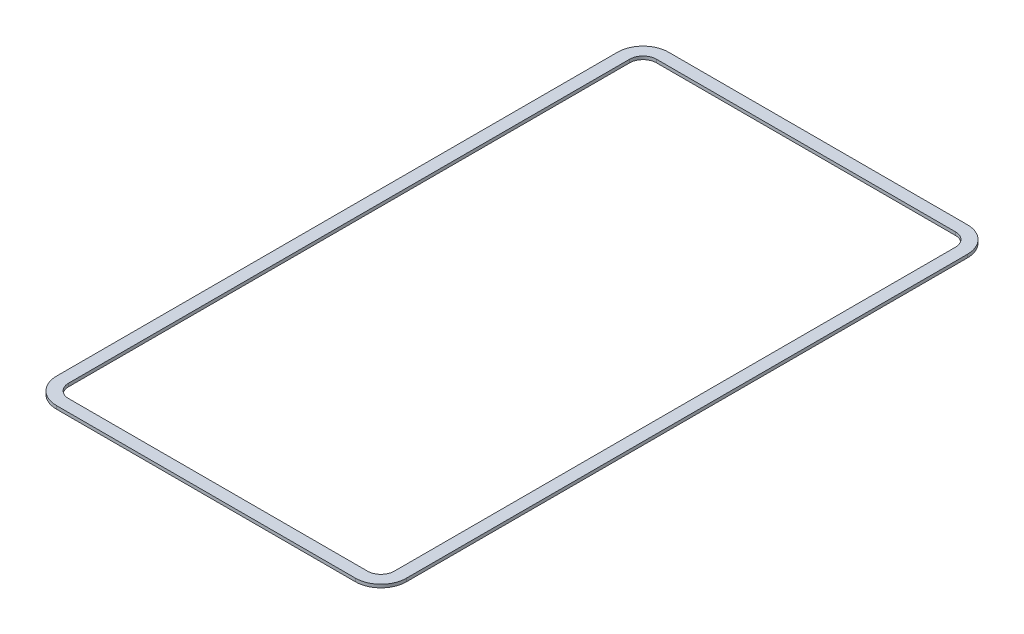
ISO-10303-21;
HEADER;
FILE_DESCRIPTION(('STEP AP214'),'2;1');
FILE_NAME('part.step','',(''),(''),'','','');
FILE_SCHEMA(('AUTOMOTIVE_DESIGN { 1 0 10303 214 1 1 1 1 }'));
ENDSEC;
DATA;
#1=APPLICATION_CONTEXT('core data for automotive mechanical design processes');
#2=APPLICATION_PROTOCOL_DEFINITION('international standard','automotive_design',2000,#1);
#3=PRODUCT_CONTEXT('',#1,'mechanical');
#4=PRODUCT('Part','Part','',(#3));
#5=PRODUCT_RELATED_PRODUCT_CATEGORY('part','',(#4));
#6=PRODUCT_DEFINITION_FORMATION('','',#4);
#7=PRODUCT_DEFINITION_CONTEXT('part definition',#1,'design');
#8=PRODUCT_DEFINITION('design','',#6,#7);
#9=PRODUCT_DEFINITION_SHAPE('','',#8);
#10=(LENGTH_UNIT() NAMED_UNIT(*) SI_UNIT(.MILLI.,.METRE.));
#11=(NAMED_UNIT(*) PLANE_ANGLE_UNIT() SI_UNIT($,.RADIAN.));
#12=(NAMED_UNIT(*) SI_UNIT($,.STERADIAN.) SOLID_ANGLE_UNIT());
#13=UNCERTAINTY_MEASURE_WITH_UNIT(LENGTH_MEASURE(1.E-05),#10,'distance_accuracy_value','');
#14=(GEOMETRIC_REPRESENTATION_CONTEXT(3) GLOBAL_UNCERTAINTY_ASSIGNED_CONTEXT((#13)) GLOBAL_UNIT_ASSIGNED_CONTEXT((#10,
#11,#12)) REPRESENTATION_CONTEXT('',''));
#15=CARTESIAN_POINT('',(0.,0.,0.));
#16=DIRECTION('',(0.,0.,1.));
#17=DIRECTION('',(1.,0.,0.));
#18=AXIS2_PLACEMENT_3D('',#15,#16,#17);
#19=CARTESIAN_POINT('',(-107.894695316434,0.5,-53.4146718146718));
#20=DIRECTION('',(0.,1.,0.));
#21=DIRECTION('',(0.,0.,1.));
#22=AXIS2_PLACEMENT_3D('',#19,#20,#21);
#23=PLANE('',#22);
#24=CARTESIAN_POINT('',(-107.894695316434,0.5,-53.4146718146718));
#25=DIRECTION('',(0.,1.,0.));
#26=DIRECTION('',(0.,0.,1.));
#27=AXIS2_PLACEMENT_3D('',#24,#25,#26);
#28=CIRCLE('',#27,4.);
#29=CARTESIAN_POINT('',(-107.894695316434,0.5,-57.4146718146718));
#30=VERTEX_POINT('',#29);
#31=CARTESIAN_POINT('',(-111.894695316434,0.5,-53.4146718146718));
#32=VERTEX_POINT('',#31);
#33=EDGE_CURVE('E270',#30,#32,#28,.T.);
#34=ORIENTED_EDGE('',*,*,#33,.T.);
#35=DIRECTION('',(0.,0.,1.));
#36=VECTOR('',#35,1.);
#37=CARTESIAN_POINT('',(-111.894695316434,0.5,-53.4146718146718));
#38=LINE('',#37,#36);
#39=CARTESIAN_POINT('',(-111.894695316434,0.5,34.5853281853282));
#40=VERTEX_POINT('',#39);
#41=EDGE_CURVE('E273',#32,#40,#38,.T.);
#42=ORIENTED_EDGE('',*,*,#41,.T.);
#43=CARTESIAN_POINT('',(-107.894695316434,0.5,34.5853281853282));
#44=DIRECTION('',(0.,1.,0.));
#45=DIRECTION('',(0.,0.,1.));
#46=AXIS2_PLACEMENT_3D('',#43,#44,#45);
#47=CIRCLE('',#46,4.);
#48=CARTESIAN_POINT('',(-107.894695316434,0.5,38.5853281853282));
#49=VERTEX_POINT('',#48);
#50=EDGE_CURVE('E276',#40,#49,#47,.T.);
#51=ORIENTED_EDGE('',*,*,#50,.T.);
#52=DIRECTION('',(1.,0.,0.));
#53=VECTOR('',#52,1.);
#54=CARTESIAN_POINT('',(-107.894695316434,0.5,38.5853281853282));
#55=LINE('',#54,#53);
#56=CARTESIAN_POINT('',(-61.0084676591858,0.5,38.5853281853282));
#57=VERTEX_POINT('',#56);
#58=EDGE_CURVE('E278',#49,#57,#55,.T.);
#59=ORIENTED_EDGE('',*,*,#58,.T.);
#60=CARTESIAN_POINT('',(-61.0084676591858,0.5,34.5853281853282));
#61=DIRECTION('',(0.,1.,0.));
#62=DIRECTION('',(0.,0.,1.));
#63=AXIS2_PLACEMENT_3D('',#60,#61,#62);
#64=CIRCLE('',#63,3.99999999999999);
#65=CARTESIAN_POINT('',(-57.0084676591858,0.5,34.5853281853282));
#66=VERTEX_POINT('',#65);
#67=EDGE_CURVE('E280',#57,#66,#64,.T.);
#68=ORIENTED_EDGE('',*,*,#67,.T.);
#69=DIRECTION('',(0.,0.,1.));
#70=VECTOR('',#69,1.);
#71=CARTESIAN_POINT('',(-57.0084676591858,0.5,-53.4146718146718));
#72=LINE('',#71,#70);
#73=CARTESIAN_POINT('',(-57.0084676591858,0.5,-53.4146718146718));
#74=VERTEX_POINT('',#73);
#75=EDGE_CURVE('E282',#74,#66,#72,.T.);
#76=ORIENTED_EDGE('',*,*,#75,.F.);
#77=CARTESIAN_POINT('',(-61.0084676591858,0.5,-53.4146718146718));
#78=DIRECTION('',(0.,-1.,0.));
#79=DIRECTION('',(0.,0.,-1.));
#80=AXIS2_PLACEMENT_3D('',#77,#78,#79);
#81=CIRCLE('',#80,4.);
#82=CARTESIAN_POINT('',(-61.0084676591858,0.5,-57.4146718146718));
#83=VERTEX_POINT('',#82);
#84=EDGE_CURVE('E285',#83,#74,#81,.T.);
#85=ORIENTED_EDGE('',*,*,#84,.F.);
#86=DIRECTION('',(1.,0.,0.));
#87=VECTOR('',#86,1.);
#88=CARTESIAN_POINT('',(-107.894695316434,0.5,-57.4146718146718));
#89=LINE('',#88,#87);
#90=EDGE_CURVE('E288',#30,#83,#89,.T.);
#91=ORIENTED_EDGE('',*,*,#90,.F.);
#92=EDGE_LOOP('',(#34,#42,#51,#59,#68,#76,#85,#91));
#93=FACE_BOUND('',#92,.T.);
#94=DIRECTION('',(0.,0.,1.));
#95=VECTOR('',#94,1.);
#96=CARTESIAN_POINT('',(-109.994695316434,0.5,-53.4146718146718));
#97=LINE('',#96,#95);
#98=CARTESIAN_POINT('',(-109.994695316434,0.5,-53.4146718146718));
#99=VERTEX_POINT('',#98);
#100=CARTESIAN_POINT('',(-109.994695316434,0.5,34.5853281853282));
#101=VERTEX_POINT('',#100);
#102=EDGE_CURVE('E212',#99,#101,#97,.T.);
#103=ORIENTED_EDGE('',*,*,#102,.F.);
#104=CARTESIAN_POINT('',(-107.894695316434,0.5,-53.4146718146718));
#105=DIRECTION('',(0.,1.,0.));
#106=DIRECTION('',(0.,0.,1.));
#107=AXIS2_PLACEMENT_3D('',#104,#105,#106);
#108=CIRCLE('',#107,2.1);
#109=CARTESIAN_POINT('',(-107.894695316434,0.5,-55.5146718146718));
#110=VERTEX_POINT('',#109);
#111=EDGE_CURVE('E203',#110,#99,#108,.T.);
#112=ORIENTED_EDGE('',*,*,#111,.F.);
#113=DIRECTION('',(1.,0.,0.));
#114=VECTOR('',#113,1.);
#115=CARTESIAN_POINT('',(-107.894695316434,0.5,-55.5146718146718));
#116=LINE('',#115,#114);
#117=CARTESIAN_POINT('',(-61.0084676591858,0.5,-55.5146718146718));
#118=VERTEX_POINT('',#117);
#119=EDGE_CURVE('E237',#110,#118,#116,.T.);
#120=ORIENTED_EDGE('',*,*,#119,.T.);
#121=CARTESIAN_POINT('',(-61.0084676591858,0.5,-53.4146718146718));
#122=DIRECTION('',(0.,-1.,0.));
#123=DIRECTION('',(0.,0.,-1.));
#124=AXIS2_PLACEMENT_3D('',#121,#122,#123);
#125=CIRCLE('',#124,2.09999999999999);
#126=CARTESIAN_POINT('',(-58.9084676591858,0.5,-53.4146718146718));
#127=VERTEX_POINT('',#126);
#128=EDGE_CURVE('E106',#118,#127,#125,.T.);
#129=ORIENTED_EDGE('',*,*,#128,.T.);
#130=DIRECTION('',(0.,0.,1.));
#131=VECTOR('',#130,1.);
#132=CARTESIAN_POINT('',(-58.9084676591858,0.5,-53.4146718146718));
#133=LINE('',#132,#131);
#134=CARTESIAN_POINT('',(-58.9084676591858,0.5,34.5853281853282));
#135=VERTEX_POINT('',#134);
#136=EDGE_CURVE('E233',#127,#135,#133,.T.);
#137=ORIENTED_EDGE('',*,*,#136,.T.);
#138=CARTESIAN_POINT('',(-61.0084676591858,0.5,34.5853281853282));
#139=DIRECTION('',(0.,1.,0.));
#140=DIRECTION('',(0.,0.,1.));
#141=AXIS2_PLACEMENT_3D('',#138,#139,#140);
#142=CIRCLE('',#141,2.1);
#143=CARTESIAN_POINT('',(-61.0084676591858,0.5,36.6853281853282));
#144=VERTEX_POINT('',#143);
#145=EDGE_CURVE('E231',#144,#135,#142,.T.);
#146=ORIENTED_EDGE('',*,*,#145,.F.);
#147=DIRECTION('',(1.,0.,0.));
#148=VECTOR('',#147,1.);
#149=CARTESIAN_POINT('',(-107.894695316434,0.5,36.6853281853282));
#150=LINE('',#149,#148);
#151=CARTESIAN_POINT('',(-107.894695316434,0.5,36.6853281853282));
#152=VERTEX_POINT('',#151);
#153=EDGE_CURVE('E227',#152,#144,#150,.T.);
#154=ORIENTED_EDGE('',*,*,#153,.F.);
#155=CARTESIAN_POINT('',(-107.894695316434,0.5,34.5853281853282));
#156=DIRECTION('',(0.,1.,0.));
#157=DIRECTION('',(0.,0.,1.));
#158=AXIS2_PLACEMENT_3D('',#155,#156,#157);
#159=CIRCLE('',#158,2.1);
#160=EDGE_CURVE('E225',#101,#152,#159,.T.);
#161=ORIENTED_EDGE('',*,*,#160,.F.);
#162=EDGE_LOOP('',(#103,#112,#120,#129,#137,#146,#154,#161));
#163=FACE_BOUND('',#162,.T.);
#164=ADVANCED_FACE('F91',(#93,#163),#23,.T.);
#165=CARTESIAN_POINT('',(-107.894695316434,0.,-53.4146718146718));
#166=DIRECTION('',(0.,1.,0.));
#167=DIRECTION('',(0.,0.,1.));
#168=AXIS2_PLACEMENT_3D('',#165,#166,#167);
#169=PLANE('',#168);
#170=CARTESIAN_POINT('',(-107.894695316434,0.,-53.4146718146718));
#171=DIRECTION('',(0.,1.,0.));
#172=DIRECTION('',(0.,0.,1.));
#173=AXIS2_PLACEMENT_3D('',#170,#171,#172);
#174=CIRCLE('',#173,4.);
#175=CARTESIAN_POINT('',(-107.894695316434,0.,-57.4146718146718));
#176=VERTEX_POINT('',#175);
#177=CARTESIAN_POINT('',(-111.894695316434,0.,-53.4146718146718));
#178=VERTEX_POINT('',#177);
#179=EDGE_CURVE('E220',#176,#178,#174,.T.);
#180=ORIENTED_EDGE('',*,*,#179,.F.);
#181=DIRECTION('',(1.,0.,0.));
#182=VECTOR('',#181,1.);
#183=CARTESIAN_POINT('',(-107.894695316434,0.,-57.4146718146718));
#184=LINE('',#183,#182);
#185=CARTESIAN_POINT('',(-61.0084676591858,0.,-57.4146718146718));
#186=VERTEX_POINT('',#185);
#187=EDGE_CURVE('E274',#176,#186,#184,.T.);
#188=ORIENTED_EDGE('',*,*,#187,.T.);
#189=CARTESIAN_POINT('',(-61.0084676591858,0.,-53.4146718146718));
#190=DIRECTION('',(0.,-1.,0.));
#191=DIRECTION('',(0.,0.,-1.));
#192=AXIS2_PLACEMENT_3D('',#189,#190,#191);
#193=CIRCLE('',#192,4.);
#194=CARTESIAN_POINT('',(-57.0084676591858,0.,-53.4146718146718));
#195=VERTEX_POINT('',#194);
#196=EDGE_CURVE('E306',#186,#195,#193,.T.);
#197=ORIENTED_EDGE('',*,*,#196,.T.);
#198=DIRECTION('',(0.,0.,1.));
#199=VECTOR('',#198,1.);
#200=CARTESIAN_POINT('',(-57.0084676591858,0.,-53.4146718146718));
#201=LINE('',#200,#199);
#202=CARTESIAN_POINT('',(-57.0084676591858,0.,34.5853281853282));
#203=VERTEX_POINT('',#202);
#204=EDGE_CURVE('E303',#195,#203,#201,.T.);
#205=ORIENTED_EDGE('',*,*,#204,.T.);
#206=CARTESIAN_POINT('',(-61.0084676591858,0.,34.5853281853282));
#207=DIRECTION('',(0.,1.,0.));
#208=DIRECTION('',(0.,0.,1.));
#209=AXIS2_PLACEMENT_3D('',#206,#207,#208);
#210=CIRCLE('',#209,3.99999999999999);
#211=CARTESIAN_POINT('',(-61.0084676591858,0.,38.5853281853282));
#212=VERTEX_POINT('',#211);
#213=EDGE_CURVE('E300',#212,#203,#210,.T.);
#214=ORIENTED_EDGE('',*,*,#213,.F.);
#215=DIRECTION('',(1.,0.,0.));
#216=VECTOR('',#215,1.);
#217=CARTESIAN_POINT('',(-107.894695316434,0.,38.5853281853282));
#218=LINE('',#217,#216);
#219=CARTESIAN_POINT('',(-107.894695316434,0.,38.5853281853282));
#220=VERTEX_POINT('',#219);
#221=EDGE_CURVE('E298',#220,#212,#218,.T.);
#222=ORIENTED_EDGE('',*,*,#221,.F.);
#223=CARTESIAN_POINT('',(-107.894695316434,0.,34.5853281853282));
#224=DIRECTION('',(0.,1.,0.));
#225=DIRECTION('',(0.,0.,1.));
#226=AXIS2_PLACEMENT_3D('',#223,#224,#225);
#227=CIRCLE('',#226,4.);
#228=CARTESIAN_POINT('',(-111.894695316434,0.,34.5853281853282));
#229=VERTEX_POINT('',#228);
#230=EDGE_CURVE('E296',#229,#220,#227,.T.);
#231=ORIENTED_EDGE('',*,*,#230,.F.);
#232=DIRECTION('',(0.,0.,1.));
#233=VECTOR('',#232,1.);
#234=CARTESIAN_POINT('',(-111.894695316434,0.,-53.4146718146718));
#235=LINE('',#234,#233);
#236=EDGE_CURVE('E294',#178,#229,#235,.T.);
#237=ORIENTED_EDGE('',*,*,#236,.F.);
#238=EDGE_LOOP('',(#180,#188,#197,#205,#214,#222,#231,#237));
#239=FACE_BOUND('',#238,.T.);
#240=CARTESIAN_POINT('',(-107.894695316434,0.,-53.4146718146718));
#241=DIRECTION('',(0.,1.,0.));
#242=DIRECTION('',(0.,0.,1.));
#243=AXIS2_PLACEMENT_3D('',#240,#241,#242);
#244=CIRCLE('',#243,2.1);
#245=CARTESIAN_POINT('',(-107.894695316434,0.,-55.5146718146718));
#246=VERTEX_POINT('',#245);
#247=CARTESIAN_POINT('',(-109.994695316434,0.,-53.4146718146718));
#248=VERTEX_POINT('',#247);
#249=EDGE_CURVE('E114',#246,#248,#244,.T.);
#250=ORIENTED_EDGE('',*,*,#249,.T.);
#251=DIRECTION('',(0.,0.,1.));
#252=VECTOR('',#251,1.);
#253=CARTESIAN_POINT('',(-109.994695316434,0.,-53.4146718146718));
#254=LINE('',#253,#252);
#255=CARTESIAN_POINT('',(-109.994695316434,0.,34.5853281853282));
#256=VERTEX_POINT('',#255);
#257=EDGE_CURVE('E219',#248,#256,#254,.T.);
#258=ORIENTED_EDGE('',*,*,#257,.T.);
#259=CARTESIAN_POINT('',(-107.894695316434,0.,34.5853281853282));
#260=DIRECTION('',(0.,1.,0.));
#261=DIRECTION('',(0.,0.,1.));
#262=AXIS2_PLACEMENT_3D('',#259,#260,#261);
#263=CIRCLE('',#262,2.1);
#264=CARTESIAN_POINT('',(-107.894695316434,0.,36.6853281853282));
#265=VERTEX_POINT('',#264);
#266=EDGE_CURVE('E241',#256,#265,#263,.T.);
#267=ORIENTED_EDGE('',*,*,#266,.T.);
#268=DIRECTION('',(1.,0.,0.));
#269=VECTOR('',#268,1.);
#270=CARTESIAN_POINT('',(-107.894695316434,0.,36.6853281853282));
#271=LINE('',#270,#269);
#272=CARTESIAN_POINT('',(-61.0084676591858,0.,36.6853281853282));
#273=VERTEX_POINT('',#272);
#274=EDGE_CURVE('E244',#265,#273,#271,.T.);
#275=ORIENTED_EDGE('',*,*,#274,.T.);
#276=CARTESIAN_POINT('',(-61.0084676591858,0.,34.5853281853282));
#277=DIRECTION('',(0.,1.,0.));
#278=DIRECTION('',(0.,0.,1.));
#279=AXIS2_PLACEMENT_3D('',#276,#277,#278);
#280=CIRCLE('',#279,2.1);
#281=CARTESIAN_POINT('',(-58.9084676591858,0.,34.5853281853282));
#282=VERTEX_POINT('',#281);
#283=EDGE_CURVE('E247',#273,#282,#280,.T.);
#284=ORIENTED_EDGE('',*,*,#283,.T.);
#285=DIRECTION('',(0.,0.,1.));
#286=VECTOR('',#285,1.);
#287=CARTESIAN_POINT('',(-58.9084676591858,0.,-53.4146718146718));
#288=LINE('',#287,#286);
#289=CARTESIAN_POINT('',(-58.9084676591858,0.,-53.4146718146718));
#290=VERTEX_POINT('',#289);
#291=EDGE_CURVE('E250',#290,#282,#288,.T.);
#292=ORIENTED_EDGE('',*,*,#291,.F.);
#293=CARTESIAN_POINT('',(-61.0084676591858,0.,-53.4146718146718));
#294=DIRECTION('',(0.,-1.,0.));
#295=DIRECTION('',(0.,0.,-1.));
#296=AXIS2_PLACEMENT_3D('',#293,#294,#295);
#297=CIRCLE('',#296,2.09999999999999);
#298=CARTESIAN_POINT('',(-61.0084676591858,0.,-55.5146718146718));
#299=VERTEX_POINT('',#298);
#300=EDGE_CURVE('E253',#299,#290,#297,.T.);
#301=ORIENTED_EDGE('',*,*,#300,.F.);
#302=DIRECTION('',(1.,0.,0.));
#303=VECTOR('',#302,1.);
#304=CARTESIAN_POINT('',(-107.894695316434,0.,-55.5146718146718));
#305=LINE('',#304,#303);
#306=EDGE_CURVE('E213',#246,#299,#305,.T.);
#307=ORIENTED_EDGE('',*,*,#306,.F.);
#308=EDGE_LOOP('',(#250,#258,#267,#275,#284,#292,#301,#307));
#309=FACE_BOUND('',#308,.T.);
#310=ADVANCED_FACE('F334',(#239,#309),#169,.F.);
#311=CARTESIAN_POINT('',(-107.894695316434,0.5,-53.4146718146718));
#312=DIRECTION('',(0.,-1.,0.));
#313=DIRECTION('',(0.,0.,-1.));
#314=AXIS2_PLACEMENT_3D('',#311,#312,#313);
#315=CYLINDRICAL_SURFACE('',#314,4.);
#316=ORIENTED_EDGE('',*,*,#179,.T.);
#317=DIRECTION('',(0.,-1.,0.));
#318=VECTOR('',#317,1.);
#319=CARTESIAN_POINT('',(-111.894695316434,0.5,-53.4146718146718));
#320=LINE('',#319,#318);
#321=EDGE_CURVE('E12',#32,#178,#320,.T.);
#322=ORIENTED_EDGE('',*,*,#321,.F.);
#323=ORIENTED_EDGE('',*,*,#33,.F.);
#324=DIRECTION('',(0.,-1.,0.));
#325=VECTOR('',#324,1.);
#326=CARTESIAN_POINT('',(-107.894695316434,0.5,-57.4146718146718));
#327=LINE('',#326,#325);
#328=EDGE_CURVE('E291',#30,#176,#327,.T.);
#329=ORIENTED_EDGE('',*,*,#328,.T.);
#330=EDGE_LOOP('',(#316,#322,#323,#329));
#331=FACE_BOUND('',#330,.T.);
#332=ADVANCED_FACE('F93',(#331),#315,.T.);
#333=CARTESIAN_POINT('',(-111.894695316434,0.5,-53.4146718146718));
#334=DIRECTION('',(1.,0.,0.));
#335=DIRECTION('',(0.,0.,-1.));
#336=AXIS2_PLACEMENT_3D('',#333,#334,#335);
#337=PLANE('',#336);
#338=ORIENTED_EDGE('',*,*,#236,.T.);
#339=DIRECTION('',(0.,-1.,0.));
#340=VECTOR('',#339,1.);
#341=CARTESIAN_POINT('',(-111.894695316434,0.5,34.5853281853282));
#342=LINE('',#341,#340);
#343=EDGE_CURVE('E99',#40,#229,#342,.T.);
#344=ORIENTED_EDGE('',*,*,#343,.F.);
#345=ORIENTED_EDGE('',*,*,#41,.F.);
#346=ORIENTED_EDGE('',*,*,#321,.T.);
#347=EDGE_LOOP('',(#338,#344,#345,#346));
#348=FACE_BOUND('',#347,.T.);
#349=ADVANCED_FACE('F351',(#348),#337,.F.);
#350=CARTESIAN_POINT('',(-107.894695316434,0.5,34.5853281853282));
#351=DIRECTION('',(0.,-1.,0.));
#352=DIRECTION('',(0.,0.,-1.));
#353=AXIS2_PLACEMENT_3D('',#350,#351,#352);
#354=CYLINDRICAL_SURFACE('',#353,4.);
#355=ORIENTED_EDGE('',*,*,#230,.T.);
#356=DIRECTION('',(0.,-1.,0.));
#357=VECTOR('',#356,1.);
#358=CARTESIAN_POINT('',(-107.894695316434,0.5,38.5853281853282));
#359=LINE('',#358,#357);
#360=EDGE_CURVE('E321',#49,#220,#359,.T.);
#361=ORIENTED_EDGE('',*,*,#360,.F.);
#362=ORIENTED_EDGE('',*,*,#50,.F.);
#363=ORIENTED_EDGE('',*,*,#343,.T.);
#364=EDGE_LOOP('',(#355,#361,#362,#363));
#365=FACE_BOUND('',#364,.T.);
#366=ADVANCED_FACE('F328',(#365),#354,.T.);
#367=CARTESIAN_POINT('',(-107.894695316434,0.5,38.5853281853282));
#368=DIRECTION('',(0.,0.,-1.));
#369=DIRECTION('',(-1.,0.,0.));
#370=AXIS2_PLACEMENT_3D('',#367,#368,#369);
#371=PLANE('',#370);
#372=ORIENTED_EDGE('',*,*,#221,.T.);
#373=DIRECTION('',(0.,-1.,0.));
#374=VECTOR('',#373,1.);
#375=CARTESIAN_POINT('',(-61.0084676591858,0.5,38.5853281853282));
#376=LINE('',#375,#374);
#377=EDGE_CURVE('E318',#57,#212,#376,.T.);
#378=ORIENTED_EDGE('',*,*,#377,.F.);
#379=ORIENTED_EDGE('',*,*,#58,.F.);
#380=ORIENTED_EDGE('',*,*,#360,.T.);
#381=EDGE_LOOP('',(#372,#378,#379,#380));
#382=FACE_BOUND('',#381,.T.);
#383=ADVANCED_FACE('F339',(#382),#371,.F.);
#384=CARTESIAN_POINT('',(-61.0084676591858,0.5,34.5853281853282));
#385=DIRECTION('',(0.,-1.,0.));
#386=DIRECTION('',(0.,0.,-1.));
#387=AXIS2_PLACEMENT_3D('',#384,#385,#386);
#388=CYLINDRICAL_SURFACE('',#387,3.99999999999999);
#389=ORIENTED_EDGE('',*,*,#213,.T.);
#390=DIRECTION('',(0.,-1.,0.));
#391=VECTOR('',#390,1.);
#392=CARTESIAN_POINT('',(-57.0084676591858,0.5,34.5853281853282));
#393=LINE('',#392,#391);
#394=EDGE_CURVE('E316',#66,#203,#393,.T.);
#395=ORIENTED_EDGE('',*,*,#394,.F.);
#396=ORIENTED_EDGE('',*,*,#67,.F.);
#397=ORIENTED_EDGE('',*,*,#377,.T.);
#398=EDGE_LOOP('',(#389,#395,#396,#397));
#399=FACE_BOUND('',#398,.T.);
#400=ADVANCED_FACE('F343',(#399),#388,.T.);
#401=CARTESIAN_POINT('',(-57.0084676591858,0.5,-53.4146718146718));
#402=DIRECTION('',(1.,0.,0.));
#403=DIRECTION('',(0.,0.,-1.));
#404=AXIS2_PLACEMENT_3D('',#401,#402,#403);
#405=PLANE('',#404);
#406=ORIENTED_EDGE('',*,*,#204,.F.);
#407=DIRECTION('',(0.,-1.,0.));
#408=VECTOR('',#407,1.);
#409=CARTESIAN_POINT('',(-57.0084676591858,0.5,-53.4146718146718));
#410=LINE('',#409,#408);
#411=EDGE_CURVE('E314',#74,#195,#410,.T.);
#412=ORIENTED_EDGE('',*,*,#411,.F.);
#413=ORIENTED_EDGE('',*,*,#75,.T.);
#414=ORIENTED_EDGE('',*,*,#394,.T.);
#415=EDGE_LOOP('',(#406,#412,#413,#414));
#416=FACE_BOUND('',#415,.T.);
#417=ADVANCED_FACE('F361',(#416),#405,.T.);
#418=CARTESIAN_POINT('',(-61.0084676591858,0.5,-53.4146718146718));
#419=DIRECTION('',(0.,-1.,0.));
#420=DIRECTION('',(0.,0.,-1.));
#421=AXIS2_PLACEMENT_3D('',#418,#419,#420);
#422=CYLINDRICAL_SURFACE('',#421,4.);
#423=ORIENTED_EDGE('',*,*,#196,.F.);
#424=DIRECTION('',(0.,-1.,0.));
#425=VECTOR('',#424,1.);
#426=CARTESIAN_POINT('',(-61.0084676591858,0.5,-57.4146718146718));
#427=LINE('',#426,#425);
#428=EDGE_CURVE('E312',#83,#186,#427,.T.);
#429=ORIENTED_EDGE('',*,*,#428,.F.);
#430=ORIENTED_EDGE('',*,*,#84,.T.);
#431=ORIENTED_EDGE('',*,*,#411,.T.);
#432=EDGE_LOOP('',(#423,#429,#430,#431));
#433=FACE_BOUND('',#432,.T.);
#434=ADVANCED_FACE('F358',(#433),#422,.T.);
#435=CARTESIAN_POINT('',(-107.894695316434,0.5,-57.4146718146718));
#436=DIRECTION('',(0.,0.,-1.));
#437=DIRECTION('',(-1.,0.,0.));
#438=AXIS2_PLACEMENT_3D('',#435,#436,#437);
#439=PLANE('',#438);
#440=ORIENTED_EDGE('',*,*,#187,.F.);
#441=ORIENTED_EDGE('',*,*,#328,.F.);
#442=ORIENTED_EDGE('',*,*,#90,.T.);
#443=ORIENTED_EDGE('',*,*,#428,.T.);
#444=EDGE_LOOP('',(#440,#441,#442,#443));
#445=FACE_BOUND('',#444,.T.);
#446=ADVANCED_FACE('F355',(#445),#439,.T.);
#447=CARTESIAN_POINT('',(-107.894695316434,0.5,-53.4146718146718));
#448=DIRECTION('',(0.,-1.,0.));
#449=DIRECTION('',(0.,0.,-1.));
#450=AXIS2_PLACEMENT_3D('',#447,#448,#449);
#451=CYLINDRICAL_SURFACE('',#450,2.1);
#452=ORIENTED_EDGE('',*,*,#249,.F.);
#453=DIRECTION('',(0.,-1.,0.));
#454=VECTOR('',#453,1.);
#455=CARTESIAN_POINT('',(-107.894695316434,0.5,-55.5146718146718));
#456=LINE('',#455,#454);
#457=EDGE_CURVE('E207',#110,#246,#456,.T.);
#458=ORIENTED_EDGE('',*,*,#457,.F.);
#459=ORIENTED_EDGE('',*,*,#111,.T.);
#460=DIRECTION('',(0.,-1.,0.));
#461=VECTOR('',#460,1.);
#462=CARTESIAN_POINT('',(-109.994695316434,0.5,-53.4146718146718));
#463=LINE('',#462,#461);
#464=EDGE_CURVE('E206',#99,#248,#463,.T.);
#465=ORIENTED_EDGE('',*,*,#464,.T.);
#466=EDGE_LOOP('',(#452,#458,#459,#465));
#467=FACE_BOUND('',#466,.T.);
#468=ADVANCED_FACE('F205',(#467),#451,.F.);
#469=CARTESIAN_POINT('',(-109.994695316434,0.5,-53.4146718146718));
#470=DIRECTION('',(1.,0.,0.));
#471=DIRECTION('',(0.,0.,-1.));
#472=AXIS2_PLACEMENT_3D('',#469,#470,#471);
#473=PLANE('',#472);
#474=ORIENTED_EDGE('',*,*,#257,.F.);
#475=ORIENTED_EDGE('',*,*,#464,.F.);
#476=ORIENTED_EDGE('',*,*,#102,.T.);
#477=DIRECTION('',(0.,-1.,0.));
#478=VECTOR('',#477,1.);
#479=CARTESIAN_POINT('',(-109.994695316434,0.5,34.5853281853282));
#480=LINE('',#479,#478);
#481=EDGE_CURVE('E221',#101,#256,#480,.T.);
#482=ORIENTED_EDGE('',*,*,#481,.T.);
#483=EDGE_LOOP('',(#474,#475,#476,#482));
#484=FACE_BOUND('',#483,.T.);
#485=ADVANCED_FACE('F216',(#484),#473,.T.);
#486=CARTESIAN_POINT('',(-107.894695316434,0.5,34.5853281853282));
#487=DIRECTION('',(0.,-1.,0.));
#488=DIRECTION('',(0.,0.,-1.));
#489=AXIS2_PLACEMENT_3D('',#486,#487,#488);
#490=CYLINDRICAL_SURFACE('',#489,2.1);
#491=ORIENTED_EDGE('',*,*,#266,.F.);
#492=ORIENTED_EDGE('',*,*,#481,.F.);
#493=ORIENTED_EDGE('',*,*,#160,.T.);
#494=DIRECTION('',(0.,-1.,0.));
#495=VECTOR('',#494,1.);
#496=CARTESIAN_POINT('',(-107.894695316434,0.5,36.6853281853282));
#497=LINE('',#496,#495);
#498=EDGE_CURVE('E267',#152,#265,#497,.T.);
#499=ORIENTED_EDGE('',*,*,#498,.T.);
#500=EDGE_LOOP('',(#491,#492,#493,#499));
#501=FACE_BOUND('',#500,.T.);
#502=ADVANCED_FACE('F386',(#501),#490,.F.);
#503=CARTESIAN_POINT('',(-107.894695316434,0.5,36.6853281853282));
#504=DIRECTION('',(0.,0.,-1.));
#505=DIRECTION('',(-1.,0.,0.));
#506=AXIS2_PLACEMENT_3D('',#503,#504,#505);
#507=PLANE('',#506);
#508=ORIENTED_EDGE('',*,*,#274,.F.);
#509=ORIENTED_EDGE('',*,*,#498,.F.);
#510=ORIENTED_EDGE('',*,*,#153,.T.);
#511=DIRECTION('',(0.,-1.,0.));
#512=VECTOR('',#511,1.);
#513=CARTESIAN_POINT('',(-61.0084676591858,0.5,36.6853281853282));
#514=LINE('',#513,#512);
#515=EDGE_CURVE('E265',#144,#273,#514,.T.);
#516=ORIENTED_EDGE('',*,*,#515,.T.);
#517=EDGE_LOOP('',(#508,#509,#510,#516));
#518=FACE_BOUND('',#517,.T.);
#519=ADVANCED_FACE('F390',(#518),#507,.T.);
#520=CARTESIAN_POINT('',(-61.0084676591858,0.5,34.5853281853282));
#521=DIRECTION('',(0.,-1.,0.));
#522=DIRECTION('',(0.,0.,-1.));
#523=AXIS2_PLACEMENT_3D('',#520,#521,#522);
#524=CYLINDRICAL_SURFACE('',#523,2.1);
#525=ORIENTED_EDGE('',*,*,#283,.F.);
#526=ORIENTED_EDGE('',*,*,#515,.F.);
#527=ORIENTED_EDGE('',*,*,#145,.T.);
#528=DIRECTION('',(0.,-1.,0.));
#529=VECTOR('',#528,1.);
#530=CARTESIAN_POINT('',(-58.9084676591858,0.5,34.5853281853282));
#531=LINE('',#530,#529);
#532=EDGE_CURVE('E263',#135,#282,#531,.T.);
#533=ORIENTED_EDGE('',*,*,#532,.T.);
#534=EDGE_LOOP('',(#525,#526,#527,#533));
#535=FACE_BOUND('',#534,.T.);
#536=ADVANCED_FACE('F396',(#535),#524,.F.);
#537=CARTESIAN_POINT('',(-58.9084676591858,0.5,-53.4146718146718));
#538=DIRECTION('',(1.,0.,0.));
#539=DIRECTION('',(0.,0.,-1.));
#540=AXIS2_PLACEMENT_3D('',#537,#538,#539);
#541=PLANE('',#540);
#542=ORIENTED_EDGE('',*,*,#291,.T.);
#543=ORIENTED_EDGE('',*,*,#532,.F.);
#544=ORIENTED_EDGE('',*,*,#136,.F.);
#545=DIRECTION('',(0.,-1.,0.));
#546=VECTOR('',#545,1.);
#547=CARTESIAN_POINT('',(-58.9084676591858,0.5,-53.4146718146718));
#548=LINE('',#547,#546);
#549=EDGE_CURVE('E261',#127,#290,#548,.T.);
#550=ORIENTED_EDGE('',*,*,#549,.T.);
#551=EDGE_LOOP('',(#542,#543,#544,#550));
#552=FACE_BOUND('',#551,.T.);
#553=ADVANCED_FACE('F400',(#552),#541,.F.);
#554=CARTESIAN_POINT('',(-61.0084676591858,0.5,-53.4146718146718));
#555=DIRECTION('',(0.,-1.,0.));
#556=DIRECTION('',(0.,0.,-1.));
#557=AXIS2_PLACEMENT_3D('',#554,#555,#556);
#558=CYLINDRICAL_SURFACE('',#557,2.09999999999999);
#559=ORIENTED_EDGE('',*,*,#300,.T.);
#560=ORIENTED_EDGE('',*,*,#549,.F.);
#561=ORIENTED_EDGE('',*,*,#128,.F.);
#562=DIRECTION('',(0.,-1.,0.));
#563=VECTOR('',#562,1.);
#564=CARTESIAN_POINT('',(-61.0084676591858,0.5,-55.5146718146718));
#565=LINE('',#564,#563);
#566=EDGE_CURVE('E259',#118,#299,#565,.T.);
#567=ORIENTED_EDGE('',*,*,#566,.T.);
#568=EDGE_LOOP('',(#559,#560,#561,#567));
#569=FACE_BOUND('',#568,.T.);
#570=ADVANCED_FACE('F404',(#569),#558,.F.);
#571=CARTESIAN_POINT('',(-107.894695316434,0.5,-55.5146718146718));
#572=DIRECTION('',(0.,0.,-1.));
#573=DIRECTION('',(-1.,0.,0.));
#574=AXIS2_PLACEMENT_3D('',#571,#572,#573);
#575=PLANE('',#574);
#576=ORIENTED_EDGE('',*,*,#306,.T.);
#577=ORIENTED_EDGE('',*,*,#566,.F.);
#578=ORIENTED_EDGE('',*,*,#119,.F.);
#579=ORIENTED_EDGE('',*,*,#457,.T.);
#580=EDGE_LOOP('',(#576,#577,#578,#579));
#581=FACE_BOUND('',#580,.T.);
#582=ADVANCED_FACE('F408',(#581),#575,.F.);
#583=CLOSED_SHELL('',(#164,#310,#332,#349,#366,#383,#400,#417,#434,#446,#468,#485,#502,#519,
#536,#553,#570,#582));
#584=MANIFOLD_SOLID_BREP('B2',#583);
#585=ADVANCED_BREP_SHAPE_REPRESENTATION('',(#18,#584),#14);
#586=SHAPE_DEFINITION_REPRESENTATION(#9,#585);
ENDSEC;
END-ISO-10303-21;
